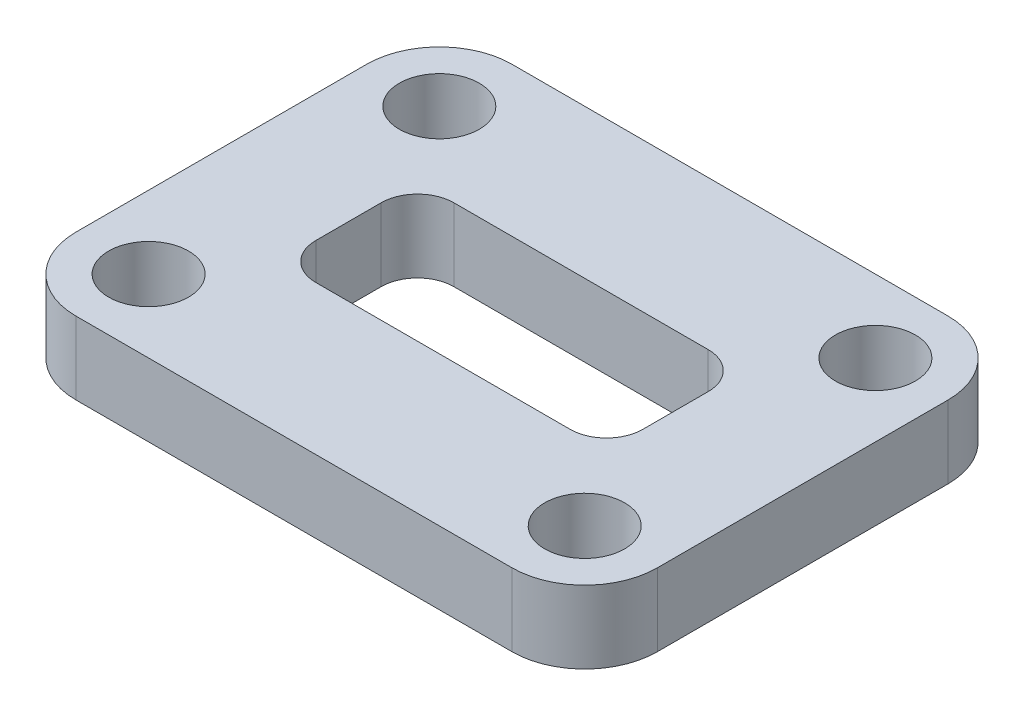
ISO-10303-21;
HEADER;
FILE_DESCRIPTION(('STEP AP214'),'2;1');
FILE_NAME('part.step','',(''),(''),'','','');
FILE_SCHEMA(('AUTOMOTIVE_DESIGN { 1 0 10303 214 1 1 1 1 }'));
ENDSEC;
DATA;
#1=APPLICATION_CONTEXT('core data for automotive mechanical design processes');
#2=APPLICATION_PROTOCOL_DEFINITION('international standard','automotive_design',2000,#1);
#3=PRODUCT_CONTEXT('',#1,'mechanical');
#4=PRODUCT('Part','Part','',(#3));
#5=PRODUCT_RELATED_PRODUCT_CATEGORY('part','',(#4));
#6=PRODUCT_DEFINITION_FORMATION('','',#4);
#7=PRODUCT_DEFINITION_CONTEXT('part definition',#1,'design');
#8=PRODUCT_DEFINITION('design','',#6,#7);
#9=PRODUCT_DEFINITION_SHAPE('','',#8);
#10=(LENGTH_UNIT() NAMED_UNIT(*) SI_UNIT(.MILLI.,.METRE.));
#11=(NAMED_UNIT(*) PLANE_ANGLE_UNIT() SI_UNIT($,.RADIAN.));
#12=(NAMED_UNIT(*) SI_UNIT($,.STERADIAN.) SOLID_ANGLE_UNIT());
#13=UNCERTAINTY_MEASURE_WITH_UNIT(LENGTH_MEASURE(1.E-05),#10,'distance_accuracy_value','');
#14=(GEOMETRIC_REPRESENTATION_CONTEXT(3) GLOBAL_UNCERTAINTY_ASSIGNED_CONTEXT((#13)) GLOBAL_UNIT_ASSIGNED_CONTEXT((#10,
#11,#12)) REPRESENTATION_CONTEXT('',''));
#15=CARTESIAN_POINT('',(0.,0.,0.));
#16=DIRECTION('',(0.,0.,1.));
#17=DIRECTION('',(1.,0.,0.));
#18=AXIS2_PLACEMENT_3D('',#15,#16,#17);
#19=CARTESIAN_POINT('',(0.,2.,6.));
#20=DIRECTION('',(0.,0.,-1.));
#21=DIRECTION('',(-1.,0.,0.));
#22=AXIS2_PLACEMENT_3D('',#19,#20,#21);
#23=PLANE('',#22);
#24=DIRECTION('',(1.,0.,0.));
#25=VECTOR('',#24,1.);
#26=CARTESIAN_POINT('',(0.,2.,6.));
#27=LINE('',#26,#25);
#28=CARTESIAN_POINT('',(-6.,2.,6.));
#29=VERTEX_POINT('',#28);
#30=CARTESIAN_POINT('',(6.,2.,6.));
#31=VERTEX_POINT('',#30);
#32=EDGE_CURVE('E168',#29,#31,#27,.T.);
#33=ORIENTED_EDGE('',*,*,#32,.F.);
#34=DIRECTION('',(0.,-1.,0.));
#35=VECTOR('',#34,1.);
#36=CARTESIAN_POINT('',(-6.,0.,6.));
#37=LINE('',#36,#35);
#38=CARTESIAN_POINT('',(-6.,0.,6.));
#39=VERTEX_POINT('',#38);
#40=EDGE_CURVE('E153',#29,#39,#37,.T.);
#41=ORIENTED_EDGE('',*,*,#40,.T.);
#42=DIRECTION('',(1.,0.,0.));
#43=VECTOR('',#42,1.);
#44=CARTESIAN_POINT('',(0.,0.,6.));
#45=LINE('',#44,#43);
#46=CARTESIAN_POINT('',(6.,0.,6.));
#47=VERTEX_POINT('',#46);
#48=EDGE_CURVE('E165',#39,#47,#45,.T.);
#49=ORIENTED_EDGE('',*,*,#48,.T.);
#50=DIRECTION('',(0.,-1.,0.));
#51=VECTOR('',#50,1.);
#52=CARTESIAN_POINT('',(6.,2.,6.));
#53=LINE('',#52,#51);
#54=EDGE_CURVE('E170',#47,#31,#53,.F.);
#55=ORIENTED_EDGE('',*,*,#54,.T.);
#56=EDGE_LOOP('',(#33,#41,#49,#55));
#57=FACE_BOUND('',#56,.T.);
#58=ADVANCED_FACE('F36',(#57),#23,.F.);
#59=CARTESIAN_POINT('',(8.,2.,0.));
#60=DIRECTION('',(-1.,0.,0.));
#61=DIRECTION('',(0.,0.,1.));
#62=AXIS2_PLACEMENT_3D('',#59,#60,#61);
#63=PLANE('',#62);
#64=DIRECTION('',(0.,0.,-1.));
#65=VECTOR('',#64,1.);
#66=CARTESIAN_POINT('',(8.,0.,0.));
#67=LINE('',#66,#65);
#68=CARTESIAN_POINT('',(8.,0.,4.));
#69=VERTEX_POINT('',#68);
#70=CARTESIAN_POINT('',(8.,0.,-4.));
#71=VERTEX_POINT('',#70);
#72=EDGE_CURVE('E176',#69,#71,#67,.T.);
#73=ORIENTED_EDGE('',*,*,#72,.T.);
#74=DIRECTION('',(0.,-1.,0.));
#75=VECTOR('',#74,1.);
#76=CARTESIAN_POINT('',(8.,2.,-4.));
#77=LINE('',#76,#75);
#78=CARTESIAN_POINT('',(8.,2.,-4.));
#79=VERTEX_POINT('',#78);
#80=EDGE_CURVE('E222',#71,#79,#77,.F.);
#81=ORIENTED_EDGE('',*,*,#80,.T.);
#82=DIRECTION('',(0.,0.,-1.));
#83=VECTOR('',#82,1.);
#84=CARTESIAN_POINT('',(8.,2.,0.));
#85=LINE('',#84,#83);
#86=CARTESIAN_POINT('',(8.,2.,4.));
#87=VERTEX_POINT('',#86);
#88=EDGE_CURVE('E284',#87,#79,#85,.T.);
#89=ORIENTED_EDGE('',*,*,#88,.F.);
#90=DIRECTION('',(0.,-1.,0.));
#91=VECTOR('',#90,1.);
#92=CARTESIAN_POINT('',(8.,2.,4.));
#93=LINE('',#92,#91);
#94=EDGE_CURVE('E219',#87,#69,#93,.T.);
#95=ORIENTED_EDGE('',*,*,#94,.T.);
#96=EDGE_LOOP('',(#73,#81,#89,#95));
#97=FACE_BOUND('',#96,.T.);
#98=ADVANCED_FACE('F336',(#97),#63,.F.);
#99=CARTESIAN_POINT('',(0.,2.,-6.));
#100=DIRECTION('',(0.,0.,-1.));
#101=DIRECTION('',(-1.,0.,0.));
#102=AXIS2_PLACEMENT_3D('',#99,#100,#101);
#103=PLANE('',#102);
#104=DIRECTION('',(1.,0.,0.));
#105=VECTOR('',#104,1.);
#106=CARTESIAN_POINT('',(0.,2.,-6.));
#107=LINE('',#106,#105);
#108=CARTESIAN_POINT('',(-6.,2.,-6.));
#109=VERTEX_POINT('',#108);
#110=CARTESIAN_POINT('',(6.,2.,-6.));
#111=VERTEX_POINT('',#110);
#112=EDGE_CURVE('E287',#109,#111,#107,.T.);
#113=ORIENTED_EDGE('',*,*,#112,.T.);
#114=DIRECTION('',(0.,-1.,0.));
#115=VECTOR('',#114,1.);
#116=CARTESIAN_POINT('',(6.,0.,-6.));
#117=LINE('',#116,#115);
#118=CARTESIAN_POINT('',(6.,0.,-6.));
#119=VERTEX_POINT('',#118);
#120=EDGE_CURVE('E216',#111,#119,#117,.T.);
#121=ORIENTED_EDGE('',*,*,#120,.T.);
#122=DIRECTION('',(1.,0.,0.));
#123=VECTOR('',#122,1.);
#124=CARTESIAN_POINT('',(0.,0.,-6.));
#125=LINE('',#124,#123);
#126=CARTESIAN_POINT('',(-6.,0.,-6.));
#127=VERTEX_POINT('',#126);
#128=EDGE_CURVE('E180',#127,#119,#125,.T.);
#129=ORIENTED_EDGE('',*,*,#128,.F.);
#130=DIRECTION('',(0.,-1.,0.));
#131=VECTOR('',#130,1.);
#132=CARTESIAN_POINT('',(-6.,2.,-6.));
#133=LINE('',#132,#131);
#134=EDGE_CURVE('E214',#127,#109,#133,.F.);
#135=ORIENTED_EDGE('',*,*,#134,.T.);
#136=EDGE_LOOP('',(#113,#121,#129,#135));
#137=FACE_BOUND('',#136,.T.);
#138=ADVANCED_FACE('F341',(#137),#103,.T.);
#139=CARTESIAN_POINT('',(4.5,2.,0.));
#140=DIRECTION('',(-1.,0.,0.));
#141=DIRECTION('',(0.,0.,1.));
#142=AXIS2_PLACEMENT_3D('',#139,#140,#141);
#143=PLANE('',#142);
#144=DIRECTION('',(0.,0.,-1.));
#145=VECTOR('',#144,1.);
#146=CARTESIAN_POINT('',(4.5,0.,0.));
#147=LINE('',#146,#145);
#148=CARTESIAN_POINT('',(4.5,0.,0.9));
#149=VERTEX_POINT('',#148);
#150=CARTESIAN_POINT('',(4.5,0.,-0.9));
#151=VERTEX_POINT('',#150);
#152=EDGE_CURVE('E258',#149,#151,#147,.T.);
#153=ORIENTED_EDGE('',*,*,#152,.F.);
#154=DIRECTION('',(0.,-1.,0.));
#155=VECTOR('',#154,1.);
#156=CARTESIAN_POINT('',(4.5,2.,0.9));
#157=LINE('',#156,#155);
#158=CARTESIAN_POINT('',(4.5,2.,0.9));
#159=VERTEX_POINT('',#158);
#160=EDGE_CURVE('E56',#149,#159,#157,.F.);
#161=ORIENTED_EDGE('',*,*,#160,.T.);
#162=DIRECTION('',(0.,0.,-1.));
#163=VECTOR('',#162,1.);
#164=CARTESIAN_POINT('',(4.5,2.,0.));
#165=LINE('',#164,#163);
#166=CARTESIAN_POINT('',(4.5,2.,-0.9));
#167=VERTEX_POINT('',#166);
#168=EDGE_CURVE('E267',#159,#167,#165,.T.);
#169=ORIENTED_EDGE('',*,*,#168,.T.);
#170=DIRECTION('',(0.,-1.,0.));
#171=VECTOR('',#170,1.);
#172=CARTESIAN_POINT('',(4.5,2.,-0.9));
#173=LINE('',#172,#171);
#174=EDGE_CURVE('E239',#167,#151,#173,.T.);
#175=ORIENTED_EDGE('',*,*,#174,.T.);
#176=EDGE_LOOP('',(#153,#161,#169,#175));
#177=FACE_BOUND('',#176,.T.);
#178=ADVANCED_FACE('F266',(#177),#143,.T.);
#179=CARTESIAN_POINT('',(0.,2.,1.9));
#180=DIRECTION('',(0.,0.,-1.));
#181=DIRECTION('',(-1.,0.,0.));
#182=AXIS2_PLACEMENT_3D('',#179,#180,#181);
#183=PLANE('',#182);
#184=DIRECTION('',(1.,0.,0.));
#185=VECTOR('',#184,1.);
#186=CARTESIAN_POINT('',(0.,0.,1.9));
#187=LINE('',#186,#185);
#188=CARTESIAN_POINT('',(-3.5,0.,1.9));
#189=VERTEX_POINT('',#188);
#190=CARTESIAN_POINT('',(3.5,0.,1.9));
#191=VERTEX_POINT('',#190);
#192=EDGE_CURVE('E305',#189,#191,#187,.T.);
#193=ORIENTED_EDGE('',*,*,#192,.F.);
#194=DIRECTION('',(0.,-1.,0.));
#195=VECTOR('',#194,1.);
#196=CARTESIAN_POINT('',(-3.5,2.,1.9));
#197=LINE('',#196,#195);
#198=CARTESIAN_POINT('',(-3.5,2.,1.9));
#199=VERTEX_POINT('',#198);
#200=EDGE_CURVE('E237',#189,#199,#197,.F.);
#201=ORIENTED_EDGE('',*,*,#200,.T.);
#202=DIRECTION('',(1.,0.,0.));
#203=VECTOR('',#202,1.);
#204=CARTESIAN_POINT('',(0.,2.,1.9));
#205=LINE('',#204,#203);
#206=CARTESIAN_POINT('',(3.5,2.,1.9));
#207=VERTEX_POINT('',#206);
#208=EDGE_CURVE('E269',#199,#207,#205,.T.);
#209=ORIENTED_EDGE('',*,*,#208,.T.);
#210=DIRECTION('',(0.,-1.,0.));
#211=VECTOR('',#210,1.);
#212=CARTESIAN_POINT('',(3.5,0.,1.9));
#213=LINE('',#212,#211);
#214=EDGE_CURVE('E234',#207,#191,#213,.T.);
#215=ORIENTED_EDGE('',*,*,#214,.T.);
#216=EDGE_LOOP('',(#193,#201,#209,#215));
#217=FACE_BOUND('',#216,.T.);
#218=ADVANCED_FACE('F325',(#217),#183,.T.);
#219=CARTESIAN_POINT('',(-4.5,2.,0.));
#220=DIRECTION('',(-1.,0.,0.));
#221=DIRECTION('',(0.,0.,1.));
#222=AXIS2_PLACEMENT_3D('',#219,#220,#221);
#223=PLANE('',#222);
#224=DIRECTION('',(0.,0.,-1.));
#225=VECTOR('',#224,1.);
#226=CARTESIAN_POINT('',(-4.5,0.,0.));
#227=LINE('',#226,#225);
#228=CARTESIAN_POINT('',(-4.5,0.,0.9));
#229=VERTEX_POINT('',#228);
#230=CARTESIAN_POINT('',(-4.5,0.,-0.9));
#231=VERTEX_POINT('',#230);
#232=EDGE_CURVE('E183',#229,#231,#227,.T.);
#233=ORIENTED_EDGE('',*,*,#232,.T.);
#234=DIRECTION('',(0.,-1.,0.));
#235=VECTOR('',#234,1.);
#236=CARTESIAN_POINT('',(-4.5,2.,-0.9));
#237=LINE('',#236,#235);
#238=CARTESIAN_POINT('',(-4.5,2.,-0.9));
#239=VERTEX_POINT('',#238);
#240=EDGE_CURVE('E232',#231,#239,#237,.F.);
#241=ORIENTED_EDGE('',*,*,#240,.T.);
#242=DIRECTION('',(0.,0.,-1.));
#243=VECTOR('',#242,1.);
#244=CARTESIAN_POINT('',(-4.5,2.,0.));
#245=LINE('',#244,#243);
#246=CARTESIAN_POINT('',(-4.5,2.,0.9));
#247=VERTEX_POINT('',#246);
#248=EDGE_CURVE('E273',#247,#239,#245,.T.);
#249=ORIENTED_EDGE('',*,*,#248,.F.);
#250=DIRECTION('',(0.,-1.,0.));
#251=VECTOR('',#250,1.);
#252=CARTESIAN_POINT('',(-4.5,2.,0.9));
#253=LINE('',#252,#251);
#254=EDGE_CURVE('E229',#247,#229,#253,.T.);
#255=ORIENTED_EDGE('',*,*,#254,.T.);
#256=EDGE_LOOP('',(#233,#241,#249,#255));
#257=FACE_BOUND('',#256,.T.);
#258=ADVANCED_FACE('F310',(#257),#223,.F.);
#259=CARTESIAN_POINT('',(6.,2.,4.));
#260=DIRECTION('',(0.,-1.,0.));
#261=DIRECTION('',(0.,0.,-1.));
#262=AXIS2_PLACEMENT_3D('',#259,#260,#261);
#263=CYLINDRICAL_SURFACE('',#262,1.1);
#264=CARTESIAN_POINT('',(6.,2.,4.));
#265=DIRECTION('',(0.,1.,0.));
#266=DIRECTION('',(0.,0.,1.));
#267=AXIS2_PLACEMENT_3D('',#264,#265,#266);
#268=CIRCLE('',#267,1.1);
#269=CARTESIAN_POINT('',(6.,2.,5.1));
#270=VERTEX_POINT('',#269);
#271=EDGE_CURVE('E293',#270,#270,#268,.T.);
#272=ORIENTED_EDGE('',*,*,#271,.T.);
#273=EDGE_LOOP('',(#272));
#274=FACE_BOUND('',#273,.T.);
#275=CARTESIAN_POINT('',(6.,0.,4.));
#276=DIRECTION('',(0.,1.,0.));
#277=DIRECTION('',(0.,0.,1.));
#278=AXIS2_PLACEMENT_3D('',#275,#276,#277);
#279=CIRCLE('',#278,1.1);
#280=CARTESIAN_POINT('',(6.,0.,5.1));
#281=VERTEX_POINT('',#280);
#282=EDGE_CURVE('E191',#281,#281,#279,.T.);
#283=ORIENTED_EDGE('',*,*,#282,.F.);
#284=EDGE_LOOP('',(#283));
#285=FACE_BOUND('',#284,.T.);
#286=ADVANCED_FACE('F352',(#274,#285),#263,.F.);
#287=CARTESIAN_POINT('',(-8.,2.,0.));
#288=DIRECTION('',(-1.,0.,0.));
#289=DIRECTION('',(0.,0.,1.));
#290=AXIS2_PLACEMENT_3D('',#287,#288,#289);
#291=PLANE('',#290);
#292=DIRECTION('',(0.,0.,-1.));
#293=VECTOR('',#292,1.);
#294=CARTESIAN_POINT('',(-8.,0.,0.));
#295=LINE('',#294,#293);
#296=CARTESIAN_POINT('',(-8.,0.,4.));
#297=VERTEX_POINT('',#296);
#298=CARTESIAN_POINT('',(-8.,0.,-4.));
#299=VERTEX_POINT('',#298);
#300=EDGE_CURVE('E189',#297,#299,#295,.T.);
#301=ORIENTED_EDGE('',*,*,#300,.F.);
#302=DIRECTION('',(0.,-1.,0.));
#303=VECTOR('',#302,1.);
#304=CARTESIAN_POINT('',(-8.,2.,4.));
#305=LINE('',#304,#303);
#306=CARTESIAN_POINT('',(-8.,2.,4.));
#307=VERTEX_POINT('',#306);
#308=EDGE_CURVE('E154',#297,#307,#305,.F.);
#309=ORIENTED_EDGE('',*,*,#308,.T.);
#310=DIRECTION('',(0.,0.,-1.));
#311=VECTOR('',#310,1.);
#312=CARTESIAN_POINT('',(-8.,2.,0.));
#313=LINE('',#312,#311);
#314=CARTESIAN_POINT('',(-8.,2.,-4.));
#315=VERTEX_POINT('',#314);
#316=EDGE_CURVE('E290',#307,#315,#313,.T.);
#317=ORIENTED_EDGE('',*,*,#316,.T.);
#318=DIRECTION('',(0.,-1.,0.));
#319=VECTOR('',#318,1.);
#320=CARTESIAN_POINT('',(-8.,2.,-4.));
#321=LINE('',#320,#319);
#322=EDGE_CURVE('E159',#315,#299,#321,.T.);
#323=ORIENTED_EDGE('',*,*,#322,.T.);
#324=EDGE_LOOP('',(#301,#309,#317,#323));
#325=FACE_BOUND('',#324,.T.);
#326=ADVANCED_FACE('F349',(#325),#291,.T.);
#327=CARTESIAN_POINT('',(0.,2.,-1.9));
#328=DIRECTION('',(0.,0.,-1.));
#329=DIRECTION('',(-1.,0.,0.));
#330=AXIS2_PLACEMENT_3D('',#327,#328,#329);
#331=PLANE('',#330);
#332=DIRECTION('',(1.,0.,0.));
#333=VECTOR('',#332,1.);
#334=CARTESIAN_POINT('',(0.,2.,-1.9));
#335=LINE('',#334,#333);
#336=CARTESIAN_POINT('',(-3.5,2.,-1.9));
#337=VERTEX_POINT('',#336);
#338=CARTESIAN_POINT('',(3.5,2.,-1.9));
#339=VERTEX_POINT('',#338);
#340=EDGE_CURVE('E281',#337,#339,#335,.T.);
#341=ORIENTED_EDGE('',*,*,#340,.F.);
#342=DIRECTION('',(0.,-1.,0.));
#343=VECTOR('',#342,1.);
#344=CARTESIAN_POINT('',(-3.5,0.,-1.9));
#345=LINE('',#344,#343);
#346=CARTESIAN_POINT('',(-3.5,0.,-1.9));
#347=VERTEX_POINT('',#346);
#348=EDGE_CURVE('E226',#337,#347,#345,.T.);
#349=ORIENTED_EDGE('',*,*,#348,.T.);
#350=DIRECTION('',(1.,0.,0.));
#351=VECTOR('',#350,1.);
#352=CARTESIAN_POINT('',(0.,0.,-1.9));
#353=LINE('',#352,#351);
#354=CARTESIAN_POINT('',(3.5,0.,-1.9));
#355=VERTEX_POINT('',#354);
#356=EDGE_CURVE('E177',#347,#355,#353,.T.);
#357=ORIENTED_EDGE('',*,*,#356,.T.);
#358=DIRECTION('',(0.,-1.,0.));
#359=VECTOR('',#358,1.);
#360=CARTESIAN_POINT('',(3.5,2.,-1.9));
#361=LINE('',#360,#359);
#362=EDGE_CURVE('E224',#355,#339,#361,.F.);
#363=ORIENTED_EDGE('',*,*,#362,.T.);
#364=EDGE_LOOP('',(#341,#349,#357,#363));
#365=FACE_BOUND('',#364,.T.);
#366=ADVANCED_FACE('F264',(#365),#331,.F.);
#367=CARTESIAN_POINT('',(-6.,2.,-4.));
#368=DIRECTION('',(0.,-1.,0.));
#369=DIRECTION('',(0.,0.,-1.));
#370=AXIS2_PLACEMENT_3D('',#367,#368,#369);
#371=CYLINDRICAL_SURFACE('',#370,1.1);
#372=CARTESIAN_POINT('',(-6.,2.,-4.));
#373=DIRECTION('',(0.,1.,0.));
#374=DIRECTION('',(0.,0.,1.));
#375=AXIS2_PLACEMENT_3D('',#372,#373,#374);
#376=CIRCLE('',#375,1.1);
#377=CARTESIAN_POINT('',(-6.,2.,-2.9));
#378=VERTEX_POINT('',#377);
#379=EDGE_CURVE('E270',#378,#378,#376,.T.);
#380=ORIENTED_EDGE('',*,*,#379,.T.);
#381=EDGE_LOOP('',(#380));
#382=FACE_BOUND('',#381,.T.);
#383=CARTESIAN_POINT('',(-6.,0.,-4.));
#384=DIRECTION('',(0.,1.,0.));
#385=DIRECTION('',(0.,0.,1.));
#386=AXIS2_PLACEMENT_3D('',#383,#384,#385);
#387=CIRCLE('',#386,1.1);
#388=CARTESIAN_POINT('',(-6.,0.,-2.9));
#389=VERTEX_POINT('',#388);
#390=EDGE_CURVE('E301',#389,#389,#387,.T.);
#391=ORIENTED_EDGE('',*,*,#390,.F.);
#392=EDGE_LOOP('',(#391));
#393=FACE_BOUND('',#392,.T.);
#394=ADVANCED_FACE('F348',(#382,#393),#371,.F.);
#395=CARTESIAN_POINT('',(-6.,2.,4.));
#396=DIRECTION('',(0.,-1.,0.));
#397=DIRECTION('',(0.,0.,-1.));
#398=AXIS2_PLACEMENT_3D('',#395,#396,#397);
#399=CYLINDRICAL_SURFACE('',#398,1.1);
#400=CARTESIAN_POINT('',(-6.,2.,4.));
#401=DIRECTION('',(0.,1.,0.));
#402=DIRECTION('',(0.,0.,1.));
#403=AXIS2_PLACEMENT_3D('',#400,#401,#402);
#404=CIRCLE('',#403,1.1);
#405=CARTESIAN_POINT('',(-6.,2.,5.1));
#406=VERTEX_POINT('',#405);
#407=EDGE_CURVE('E197',#406,#406,#404,.F.);
#408=ORIENTED_EDGE('',*,*,#407,.F.);
#409=EDGE_LOOP('',(#408));
#410=FACE_BOUND('',#409,.T.);
#411=CARTESIAN_POINT('',(-6.,0.,4.));
#412=DIRECTION('',(0.,1.,0.));
#413=DIRECTION('',(0.,0.,1.));
#414=AXIS2_PLACEMENT_3D('',#411,#412,#413);
#415=CIRCLE('',#414,1.1);
#416=CARTESIAN_POINT('',(-6.,0.,5.1));
#417=VERTEX_POINT('',#416);
#418=EDGE_CURVE('E298',#417,#417,#415,.F.);
#419=ORIENTED_EDGE('',*,*,#418,.T.);
#420=EDGE_LOOP('',(#419));
#421=FACE_BOUND('',#420,.T.);
#422=ADVANCED_FACE('F359',(#410,#421),#399,.F.);
#423=CARTESIAN_POINT('',(6.,2.,-4.));
#424=DIRECTION('',(0.,-1.,0.));
#425=DIRECTION('',(0.,0.,-1.));
#426=AXIS2_PLACEMENT_3D('',#423,#424,#425);
#427=CYLINDRICAL_SURFACE('',#426,1.1);
#428=CARTESIAN_POINT('',(6.,2.,-4.));
#429=DIRECTION('',(0.,1.,0.));
#430=DIRECTION('',(0.,0.,1.));
#431=AXIS2_PLACEMENT_3D('',#428,#429,#430);
#432=CIRCLE('',#431,1.1);
#433=CARTESIAN_POINT('',(6.,2.,-2.9));
#434=VERTEX_POINT('',#433);
#435=EDGE_CURVE('E198',#434,#434,#432,.F.);
#436=ORIENTED_EDGE('',*,*,#435,.F.);
#437=EDGE_LOOP('',(#436));
#438=FACE_BOUND('',#437,.T.);
#439=CARTESIAN_POINT('',(6.,0.,-4.));
#440=DIRECTION('',(0.,1.,0.));
#441=DIRECTION('',(0.,0.,1.));
#442=AXIS2_PLACEMENT_3D('',#439,#440,#441);
#443=CIRCLE('',#442,1.1);
#444=CARTESIAN_POINT('',(6.,0.,-2.9));
#445=VERTEX_POINT('',#444);
#446=EDGE_CURVE('E194',#445,#445,#443,.F.);
#447=ORIENTED_EDGE('',*,*,#446,.T.);
#448=EDGE_LOOP('',(#447));
#449=FACE_BOUND('',#448,.T.);
#450=ADVANCED_FACE('F363',(#438,#449),#427,.F.);
#451=CARTESIAN_POINT('',(0.,2.,0.));
#452=DIRECTION('',(0.,1.,0.));
#453=DIRECTION('',(0.,0.,1.));
#454=AXIS2_PLACEMENT_3D('',#451,#452,#453);
#455=PLANE('',#454);
#456=ORIENTED_EDGE('',*,*,#407,.T.);
#457=EDGE_LOOP('',(#456));
#458=FACE_BOUND('',#457,.T.);
#459=ORIENTED_EDGE('',*,*,#379,.F.);
#460=EDGE_LOOP('',(#459));
#461=FACE_BOUND('',#460,.T.);
#462=ORIENTED_EDGE('',*,*,#168,.F.);
#463=CARTESIAN_POINT('',(3.5,2.,0.9));
#464=DIRECTION('',(0.,1.,0.));
#465=DIRECTION('',(0.,0.,1.));
#466=AXIS2_PLACEMENT_3D('',#463,#464,#465);
#467=CIRCLE('',#466,1.);
#468=EDGE_CURVE('E253',#159,#207,#467,.F.);
#469=ORIENTED_EDGE('',*,*,#468,.T.);
#470=ORIENTED_EDGE('',*,*,#208,.F.);
#471=CARTESIAN_POINT('',(-3.5,2.,0.9));
#472=DIRECTION('',(0.,1.,0.));
#473=DIRECTION('',(0.,0.,1.));
#474=AXIS2_PLACEMENT_3D('',#471,#472,#473);
#475=CIRCLE('',#474,1.);
#476=EDGE_CURVE('E249',#199,#247,#475,.F.);
#477=ORIENTED_EDGE('',*,*,#476,.T.);
#478=ORIENTED_EDGE('',*,*,#248,.T.);
#479=CARTESIAN_POINT('',(-3.5,2.,-0.9));
#480=DIRECTION('',(0.,1.,0.));
#481=DIRECTION('',(0.,0.,1.));
#482=AXIS2_PLACEMENT_3D('',#479,#480,#481);
#483=CIRCLE('',#482,1.);
#484=EDGE_CURVE('E245',#239,#337,#483,.F.);
#485=ORIENTED_EDGE('',*,*,#484,.T.);
#486=ORIENTED_EDGE('',*,*,#340,.T.);
#487=CARTESIAN_POINT('',(3.5,2.,-0.9));
#488=DIRECTION('',(0.,1.,0.));
#489=DIRECTION('',(0.,0.,1.));
#490=AXIS2_PLACEMENT_3D('',#487,#488,#489);
#491=CIRCLE('',#490,1.);
#492=EDGE_CURVE('E11',#339,#167,#491,.F.);
#493=ORIENTED_EDGE('',*,*,#492,.T.);
#494=EDGE_LOOP('',(#462,#469,#470,#477,#478,#485,#486,#493));
#495=FACE_BOUND('',#494,.T.);
#496=ORIENTED_EDGE('',*,*,#316,.F.);
#497=CARTESIAN_POINT('',(-6.,2.,4.));
#498=DIRECTION('',(0.,1.,0.));
#499=DIRECTION('',(0.,0.,1.));
#500=AXIS2_PLACEMENT_3D('',#497,#498,#499);
#501=CIRCLE('',#500,2.);
#502=EDGE_CURVE('E212',#307,#29,#501,.T.);
#503=ORIENTED_EDGE('',*,*,#502,.T.);
#504=ORIENTED_EDGE('',*,*,#32,.T.);
#505=CARTESIAN_POINT('',(6.,2.,4.));
#506=DIRECTION('',(0.,1.,0.));
#507=DIRECTION('',(0.,0.,1.));
#508=AXIS2_PLACEMENT_3D('',#505,#506,#507);
#509=CIRCLE('',#508,2.);
#510=EDGE_CURVE('E208',#31,#87,#509,.T.);
#511=ORIENTED_EDGE('',*,*,#510,.T.);
#512=ORIENTED_EDGE('',*,*,#88,.T.);
#513=CARTESIAN_POINT('',(6.,2.,-4.));
#514=DIRECTION('',(0.,1.,0.));
#515=DIRECTION('',(0.,0.,1.));
#516=AXIS2_PLACEMENT_3D('',#513,#514,#515);
#517=CIRCLE('',#516,2.);
#518=EDGE_CURVE('E210',#79,#111,#517,.T.);
#519=ORIENTED_EDGE('',*,*,#518,.T.);
#520=ORIENTED_EDGE('',*,*,#112,.F.);
#521=CARTESIAN_POINT('',(-6.,2.,-4.));
#522=DIRECTION('',(0.,1.,0.));
#523=DIRECTION('',(0.,0.,1.));
#524=AXIS2_PLACEMENT_3D('',#521,#522,#523);
#525=CIRCLE('',#524,2.);
#526=EDGE_CURVE('E206',#109,#315,#525,.T.);
#527=ORIENTED_EDGE('',*,*,#526,.T.);
#528=EDGE_LOOP('',(#496,#503,#504,#511,#512,#519,#520,#527));
#529=FACE_BOUND('',#528,.T.);
#530=ORIENTED_EDGE('',*,*,#271,.F.);
#531=EDGE_LOOP('',(#530));
#532=FACE_BOUND('',#531,.T.);
#533=ORIENTED_EDGE('',*,*,#435,.T.);
#534=EDGE_LOOP('',(#533));
#535=FACE_BOUND('',#534,.T.);
#536=ADVANCED_FACE('F316',(#458,#461,#495,#529,#532,#535),#455,.T.);
#537=CARTESIAN_POINT('',(0.,0.,0.));
#538=DIRECTION('',(0.,1.,0.));
#539=DIRECTION('',(0.,0.,1.));
#540=AXIS2_PLACEMENT_3D('',#537,#538,#539);
#541=PLANE('',#540);
#542=ORIENTED_EDGE('',*,*,#418,.F.);
#543=EDGE_LOOP('',(#542));
#544=FACE_BOUND('',#543,.T.);
#545=ORIENTED_EDGE('',*,*,#390,.T.);
#546=EDGE_LOOP('',(#545));
#547=FACE_BOUND('',#546,.T.);
#548=ORIENTED_EDGE('',*,*,#192,.T.);
#549=CARTESIAN_POINT('',(3.5,0.,0.9));
#550=DIRECTION('',(0.,1.,0.));
#551=DIRECTION('',(0.,0.,1.));
#552=AXIS2_PLACEMENT_3D('',#549,#550,#551);
#553=CIRCLE('',#552,1.);
#554=EDGE_CURVE('E251',#191,#149,#553,.T.);
#555=ORIENTED_EDGE('',*,*,#554,.T.);
#556=ORIENTED_EDGE('',*,*,#152,.T.);
#557=CARTESIAN_POINT('',(3.5,0.,-0.9));
#558=DIRECTION('',(0.,1.,0.));
#559=DIRECTION('',(0.,0.,1.));
#560=AXIS2_PLACEMENT_3D('',#557,#558,#559);
#561=CIRCLE('',#560,1.);
#562=EDGE_CURVE('E44',#151,#355,#561,.T.);
#563=ORIENTED_EDGE('',*,*,#562,.T.);
#564=ORIENTED_EDGE('',*,*,#356,.F.);
#565=CARTESIAN_POINT('',(-3.5,0.,-0.9));
#566=DIRECTION('',(0.,1.,0.));
#567=DIRECTION('',(0.,0.,1.));
#568=AXIS2_PLACEMENT_3D('',#565,#566,#567);
#569=CIRCLE('',#568,1.);
#570=EDGE_CURVE('E243',#347,#231,#569,.T.);
#571=ORIENTED_EDGE('',*,*,#570,.T.);
#572=ORIENTED_EDGE('',*,*,#232,.F.);
#573=CARTESIAN_POINT('',(-3.5,0.,0.9));
#574=DIRECTION('',(0.,1.,0.));
#575=DIRECTION('',(0.,0.,1.));
#576=AXIS2_PLACEMENT_3D('',#573,#574,#575);
#577=CIRCLE('',#576,1.);
#578=EDGE_CURVE('E247',#229,#189,#577,.T.);
#579=ORIENTED_EDGE('',*,*,#578,.T.);
#580=EDGE_LOOP('',(#548,#555,#556,#563,#564,#571,#572,#579));
#581=FACE_BOUND('',#580,.T.);
#582=ORIENTED_EDGE('',*,*,#48,.F.);
#583=CARTESIAN_POINT('',(-6.,0.,4.));
#584=DIRECTION('',(0.,1.,0.));
#585=DIRECTION('',(0.,0.,1.));
#586=AXIS2_PLACEMENT_3D('',#583,#584,#585);
#587=CIRCLE('',#586,2.);
#588=EDGE_CURVE('E149',#39,#297,#587,.F.);
#589=ORIENTED_EDGE('',*,*,#588,.T.);
#590=ORIENTED_EDGE('',*,*,#300,.T.);
#591=CARTESIAN_POINT('',(-6.,0.,-4.));
#592=DIRECTION('',(0.,1.,0.));
#593=DIRECTION('',(0.,0.,1.));
#594=AXIS2_PLACEMENT_3D('',#591,#592,#593);
#595=CIRCLE('',#594,2.);
#596=EDGE_CURVE('E169',#299,#127,#595,.F.);
#597=ORIENTED_EDGE('',*,*,#596,.T.);
#598=ORIENTED_EDGE('',*,*,#128,.T.);
#599=CARTESIAN_POINT('',(6.,0.,-4.));
#600=DIRECTION('',(0.,1.,0.));
#601=DIRECTION('',(0.,0.,1.));
#602=AXIS2_PLACEMENT_3D('',#599,#600,#601);
#603=CIRCLE('',#602,2.);
#604=EDGE_CURVE('E160',#119,#71,#603,.F.);
#605=ORIENTED_EDGE('',*,*,#604,.T.);
#606=ORIENTED_EDGE('',*,*,#72,.F.);
#607=CARTESIAN_POINT('',(6.,0.,4.));
#608=DIRECTION('',(0.,1.,0.));
#609=DIRECTION('',(0.,0.,1.));
#610=AXIS2_PLACEMENT_3D('',#607,#608,#609);
#611=CIRCLE('',#610,2.);
#612=EDGE_CURVE('E175',#69,#47,#611,.F.);
#613=ORIENTED_EDGE('',*,*,#612,.T.);
#614=EDGE_LOOP('',(#582,#589,#590,#597,#598,#605,#606,#613));
#615=FACE_BOUND('',#614,.T.);
#616=ORIENTED_EDGE('',*,*,#282,.T.);
#617=EDGE_LOOP('',(#616));
#618=FACE_BOUND('',#617,.T.);
#619=ORIENTED_EDGE('',*,*,#446,.F.);
#620=EDGE_LOOP('',(#619));
#621=FACE_BOUND('',#620,.T.);
#622=ADVANCED_FACE('F172',(#544,#547,#581,#615,#618,#621),#541,.F.);
#623=CARTESIAN_POINT('',(-6.,2.,4.));
#624=DIRECTION('',(0.,1.,0.));
#625=DIRECTION('',(0.,0.,1.));
#626=AXIS2_PLACEMENT_3D('',#623,#624,#625);
#627=CYLINDRICAL_SURFACE('',#626,2.);
#628=ORIENTED_EDGE('',*,*,#502,.F.);
#629=ORIENTED_EDGE('',*,*,#308,.F.);
#630=ORIENTED_EDGE('',*,*,#588,.F.);
#631=ORIENTED_EDGE('',*,*,#40,.F.);
#632=EDGE_LOOP('',(#628,#629,#630,#631));
#633=FACE_BOUND('',#632,.T.);
#634=ADVANCED_FACE('F152',(#633),#627,.T.);
#635=CARTESIAN_POINT('',(6.,2.,-4.));
#636=DIRECTION('',(0.,1.,0.));
#637=DIRECTION('',(0.,0.,1.));
#638=AXIS2_PLACEMENT_3D('',#635,#636,#637);
#639=CYLINDRICAL_SURFACE('',#638,2.);
#640=ORIENTED_EDGE('',*,*,#518,.F.);
#641=ORIENTED_EDGE('',*,*,#80,.F.);
#642=ORIENTED_EDGE('',*,*,#604,.F.);
#643=ORIENTED_EDGE('',*,*,#120,.F.);
#644=EDGE_LOOP('',(#640,#641,#642,#643));
#645=FACE_BOUND('',#644,.T.);
#646=ADVANCED_FACE('F367',(#645),#639,.T.);
#647=CARTESIAN_POINT('',(6.,2.,4.));
#648=DIRECTION('',(0.,-1.,0.));
#649=DIRECTION('',(0.,0.,-1.));
#650=AXIS2_PLACEMENT_3D('',#647,#648,#649);
#651=CYLINDRICAL_SURFACE('',#650,2.);
#652=ORIENTED_EDGE('',*,*,#510,.F.);
#653=ORIENTED_EDGE('',*,*,#54,.F.);
#654=ORIENTED_EDGE('',*,*,#612,.F.);
#655=ORIENTED_EDGE('',*,*,#94,.F.);
#656=EDGE_LOOP('',(#652,#653,#654,#655));
#657=FACE_BOUND('',#656,.T.);
#658=ADVANCED_FACE('F370',(#657),#651,.T.);
#659=CARTESIAN_POINT('',(-6.,2.,-4.));
#660=DIRECTION('',(0.,-1.,0.));
#661=DIRECTION('',(0.,0.,-1.));
#662=AXIS2_PLACEMENT_3D('',#659,#660,#661);
#663=CYLINDRICAL_SURFACE('',#662,2.);
#664=ORIENTED_EDGE('',*,*,#526,.F.);
#665=ORIENTED_EDGE('',*,*,#134,.F.);
#666=ORIENTED_EDGE('',*,*,#596,.F.);
#667=ORIENTED_EDGE('',*,*,#322,.F.);
#668=EDGE_LOOP('',(#664,#665,#666,#667));
#669=FACE_BOUND('',#668,.T.);
#670=ADVANCED_FACE('F374',(#669),#663,.T.);
#671=CARTESIAN_POINT('',(-3.5,2.,-0.9));
#672=DIRECTION('',(0.,1.,0.));
#673=DIRECTION('',(0.,0.,1.));
#674=AXIS2_PLACEMENT_3D('',#671,#672,#673);
#675=CYLINDRICAL_SURFACE('',#674,1.);
#676=ORIENTED_EDGE('',*,*,#484,.F.);
#677=ORIENTED_EDGE('',*,*,#240,.F.);
#678=ORIENTED_EDGE('',*,*,#570,.F.);
#679=ORIENTED_EDGE('',*,*,#348,.F.);
#680=EDGE_LOOP('',(#676,#677,#678,#679));
#681=FACE_BOUND('',#680,.T.);
#682=ADVANCED_FACE('F315',(#681),#675,.F.);
#683=CARTESIAN_POINT('',(-3.5,2.,0.9));
#684=DIRECTION('',(0.,-1.,0.));
#685=DIRECTION('',(0.,0.,-1.));
#686=AXIS2_PLACEMENT_3D('',#683,#684,#685);
#687=CYLINDRICAL_SURFACE('',#686,1.);
#688=ORIENTED_EDGE('',*,*,#476,.F.);
#689=ORIENTED_EDGE('',*,*,#200,.F.);
#690=ORIENTED_EDGE('',*,*,#578,.F.);
#691=ORIENTED_EDGE('',*,*,#254,.F.);
#692=EDGE_LOOP('',(#688,#689,#690,#691));
#693=FACE_BOUND('',#692,.T.);
#694=ADVANCED_FACE('F321',(#693),#687,.F.);
#695=CARTESIAN_POINT('',(3.5,2.,0.9));
#696=DIRECTION('',(0.,1.,0.));
#697=DIRECTION('',(0.,0.,1.));
#698=AXIS2_PLACEMENT_3D('',#695,#696,#697);
#699=CYLINDRICAL_SURFACE('',#698,1.);
#700=ORIENTED_EDGE('',*,*,#468,.F.);
#701=ORIENTED_EDGE('',*,*,#160,.F.);
#702=ORIENTED_EDGE('',*,*,#554,.F.);
#703=ORIENTED_EDGE('',*,*,#214,.F.);
#704=EDGE_LOOP('',(#700,#701,#702,#703));
#705=FACE_BOUND('',#704,.T.);
#706=ADVANCED_FACE('F328',(#705),#699,.F.);
#707=CARTESIAN_POINT('',(3.5,2.,-0.9));
#708=DIRECTION('',(0.,-1.,0.));
#709=DIRECTION('',(0.,0.,-1.));
#710=AXIS2_PLACEMENT_3D('',#707,#708,#709);
#711=CYLINDRICAL_SURFACE('',#710,1.);
#712=ORIENTED_EDGE('',*,*,#492,.F.);
#713=ORIENTED_EDGE('',*,*,#362,.F.);
#714=ORIENTED_EDGE('',*,*,#562,.F.);
#715=ORIENTED_EDGE('',*,*,#174,.F.);
#716=EDGE_LOOP('',(#712,#713,#714,#715));
#717=FACE_BOUND('',#716,.T.);
#718=ADVANCED_FACE('F38',(#717),#711,.F.);
#719=CLOSED_SHELL('',(#58,#98,#138,#178,#218,#258,#286,#326,#366,#394,#422,#450,#536,#622,#634,
#646,#658,#670,#682,#694,#706,#718));
#720=MANIFOLD_SOLID_BREP('B2',#719);
#721=ADVANCED_BREP_SHAPE_REPRESENTATION('',(#18,#720),#14);
#722=SHAPE_DEFINITION_REPRESENTATION(#9,#721);
ENDSEC;
END-ISO-10303-21;
